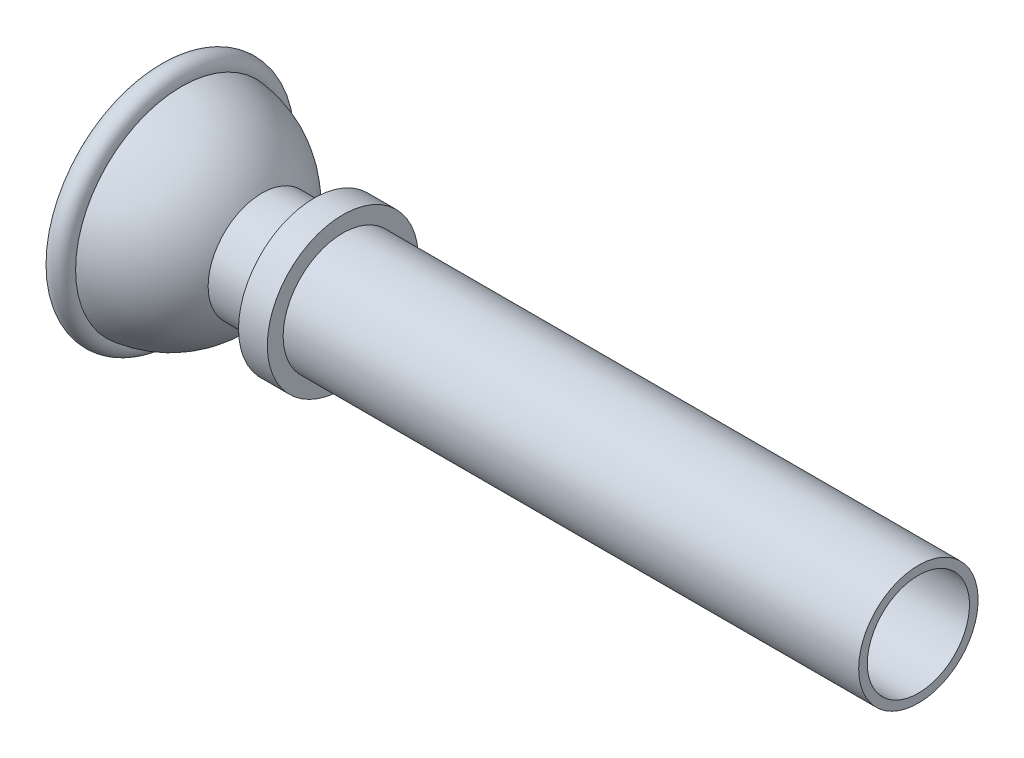
ISO-10303-21;
HEADER;
FILE_DESCRIPTION(('STEP AP214'),'2;1');
FILE_NAME('part.step','',(''),(''),'','','');
FILE_SCHEMA(('AUTOMOTIVE_DESIGN { 1 0 10303 214 1 1 1 1 }'));
ENDSEC;
DATA;
#1=APPLICATION_CONTEXT('core data for automotive mechanical design processes');
#2=APPLICATION_PROTOCOL_DEFINITION('international standard','automotive_design',2000,#1);
#3=PRODUCT_CONTEXT('',#1,'mechanical');
#4=PRODUCT('Part','Part','',(#3));
#5=PRODUCT_RELATED_PRODUCT_CATEGORY('part','',(#4));
#6=PRODUCT_DEFINITION_FORMATION('','',#4);
#7=PRODUCT_DEFINITION_CONTEXT('part definition',#1,'design');
#8=PRODUCT_DEFINITION('design','',#6,#7);
#9=PRODUCT_DEFINITION_SHAPE('','',#8);
#10=(LENGTH_UNIT() NAMED_UNIT(*) SI_UNIT(.MILLI.,.METRE.));
#11=(NAMED_UNIT(*) PLANE_ANGLE_UNIT() SI_UNIT($,.RADIAN.));
#12=(NAMED_UNIT(*) SI_UNIT($,.STERADIAN.) SOLID_ANGLE_UNIT());
#13=UNCERTAINTY_MEASURE_WITH_UNIT(LENGTH_MEASURE(1.E-05),#10,'distance_accuracy_value','');
#14=(GEOMETRIC_REPRESENTATION_CONTEXT(3) GLOBAL_UNCERTAINTY_ASSIGNED_CONTEXT((#13)) GLOBAL_UNIT_ASSIGNED_CONTEXT((#10,
#11,#12)) REPRESENTATION_CONTEXT('',''));
#15=CARTESIAN_POINT('',(0.,0.,0.));
#16=DIRECTION('',(0.,0.,1.));
#17=DIRECTION('',(1.,0.,0.));
#18=AXIS2_PLACEMENT_3D('',#15,#16,#17);
#19=CARTESIAN_POINT('',(117.558988859747,6.49609802983514,0.));
#20=DIRECTION('',(-1.,0.,0.));
#21=DIRECTION('',(0.,0.,1.));
#22=AXIS2_PLACEMENT_3D('',#19,#20,#21);
#23=PLANE('',#22);
#24=CARTESIAN_POINT('',(117.558988859747,-2.52090197016486,0.));
#25=DIRECTION('',(-1.,0.,0.));
#26=DIRECTION('',(0.,0.,1.));
#27=AXIS2_PLACEMENT_3D('',#24,#25,#26);
#28=CIRCLE('',#27,10.541);
#29=CARTESIAN_POINT('',(117.558988859747,-2.52090197016486,10.541));
#30=VERTEX_POINT('',#29);
#31=EDGE_CURVE('E10',#30,#30,#28,.T.);
#32=ORIENTED_EDGE('',*,*,#31,.F.);
#33=EDGE_LOOP('',(#32));
#34=FACE_BOUND('',#33,.T.);
#35=CARTESIAN_POINT('',(117.558988859747,-2.52090197016486,0.));
#36=DIRECTION('',(-1.,0.,0.));
#37=DIRECTION('',(0.,0.,1.));
#38=AXIS2_PLACEMENT_3D('',#35,#36,#37);
#39=CIRCLE('',#38,9.017);
#40=CARTESIAN_POINT('',(117.558988859747,-2.52090197016486,9.017));
#41=VERTEX_POINT('',#40);
#42=EDGE_CURVE('E74',#41,#41,#39,.T.);
#43=ORIENTED_EDGE('',*,*,#42,.T.);
#44=EDGE_LOOP('',(#43));
#45=FACE_BOUND('',#44,.T.);
#46=ADVANCED_FACE('F34',(#34,#45),#23,.F.);
#47=CARTESIAN_POINT('',(-17.599665340704,-2.52090197016486,0.));
#48=DIRECTION('',(-1.,0.,0.));
#49=DIRECTION('',(0.,0.,1.));
#50=AXIS2_PLACEMENT_3D('',#47,#48,#49);
#51=CYLINDRICAL_SURFACE('',#50,10.541);
#52=CARTESIAN_POINT('',(15.9589888597466,-2.52090197016486,0.));
#53=DIRECTION('',(-1.,0.,0.));
#54=DIRECTION('',(0.,0.,1.));
#55=AXIS2_PLACEMENT_3D('',#52,#53,#54);
#56=CIRCLE('',#55,10.541);
#57=CARTESIAN_POINT('',(15.9589888597466,-2.52090197016486,10.541));
#58=VERTEX_POINT('',#57);
#59=EDGE_CURVE('E40',#58,#58,#56,.T.);
#60=ORIENTED_EDGE('',*,*,#59,.F.);
#61=EDGE_LOOP('',(#60));
#62=FACE_BOUND('',#61,.T.);
#63=ORIENTED_EDGE('',*,*,#31,.T.);
#64=EDGE_LOOP('',(#63));
#65=FACE_BOUND('',#64,.T.);
#66=ADVANCED_FACE('F135',(#62,#65),#51,.T.);
#67=CARTESIAN_POINT('',(15.9589888597466,8.02009802983513,0.));
#68=DIRECTION('',(-1.,0.,0.));
#69=DIRECTION('',(0.,0.,1.));
#70=AXIS2_PLACEMENT_3D('',#67,#68,#69);
#71=PLANE('',#70);
#72=CARTESIAN_POINT('',(15.9589888597466,-2.52090197016486,0.));
#73=DIRECTION('',(-1.,0.,0.));
#74=DIRECTION('',(0.,0.,1.));
#75=AXIS2_PLACEMENT_3D('',#72,#73,#74);
#76=CIRCLE('',#75,13.335);
#77=CARTESIAN_POINT('',(15.9589888597466,-2.52090197016486,13.335));
#78=VERTEX_POINT('',#77);
#79=EDGE_CURVE('E44',#78,#78,#76,.T.);
#80=ORIENTED_EDGE('',*,*,#79,.F.);
#81=EDGE_LOOP('',(#80));
#82=FACE_BOUND('',#81,.T.);
#83=ORIENTED_EDGE('',*,*,#59,.T.);
#84=EDGE_LOOP('',(#83));
#85=FACE_BOUND('',#84,.T.);
#86=ADVANCED_FACE('F130',(#82,#85),#71,.F.);
#87=CARTESIAN_POINT('',(-17.599665340704,-2.52090197016486,0.));
#88=DIRECTION('',(-1.,0.,0.));
#89=DIRECTION('',(0.,0.,1.));
#90=AXIS2_PLACEMENT_3D('',#87,#88,#89);
#91=CYLINDRICAL_SURFACE('',#90,13.335);
#92=CARTESIAN_POINT('',(10.8789888597466,-2.52090197016486,0.));
#93=DIRECTION('',(-1.,0.,0.));
#94=DIRECTION('',(0.,0.,1.));
#95=AXIS2_PLACEMENT_3D('',#92,#93,#94);
#96=CIRCLE('',#95,13.335);
#97=CARTESIAN_POINT('',(10.8789888597466,-2.52090197016486,13.335));
#98=VERTEX_POINT('',#97);
#99=EDGE_CURVE('E48',#98,#98,#96,.T.);
#100=ORIENTED_EDGE('',*,*,#99,.F.);
#101=EDGE_LOOP('',(#100));
#102=FACE_BOUND('',#101,.T.);
#103=ORIENTED_EDGE('',*,*,#79,.T.);
#104=EDGE_LOOP('',(#103));
#105=FACE_BOUND('',#104,.T.);
#106=ADVANCED_FACE('F124',(#102,#105),#91,.T.);
#107=CARTESIAN_POINT('',(10.8789888597466,10.8140980298351,0.));
#108=DIRECTION('',(1.,0.,0.));
#109=DIRECTION('',(0.,0.,-1.));
#110=AXIS2_PLACEMENT_3D('',#107,#108,#109);
#111=PLANE('',#110);
#112=CARTESIAN_POINT('',(10.8789888597466,-2.52090197016486,0.));
#113=DIRECTION('',(-1.,0.,0.));
#114=DIRECTION('',(0.,0.,1.));
#115=AXIS2_PLACEMENT_3D('',#112,#113,#114);
#116=CIRCLE('',#115,9.51774831940588);
#117=CARTESIAN_POINT('',(10.8789888597466,-2.52090197016486,9.51774831940588));
#118=VERTEX_POINT('',#117);
#119=EDGE_CURVE('E53',#118,#118,#116,.T.);
#120=ORIENTED_EDGE('',*,*,#119,.F.);
#121=EDGE_LOOP('',(#120));
#122=FACE_BOUND('',#121,.T.);
#123=ORIENTED_EDGE('',*,*,#99,.T.);
#124=EDGE_LOOP('',(#123));
#125=FACE_BOUND('',#124,.T.);
#126=ADVANCED_FACE('F118',(#122,#125),#111,.F.);
#127=CARTESIAN_POINT('',(-17.599665340704,-2.52090197016486,0.));
#128=DIRECTION('',(-1.,0.,0.));
#129=DIRECTION('',(0.,0.,1.));
#130=AXIS2_PLACEMENT_3D('',#127,#128,#129);
#131=CYLINDRICAL_SURFACE('',#130,9.51774831940588);
#132=CARTESIAN_POINT('',(1.6960114580087,-2.52090197016486,0.));
#133=DIRECTION('',(-1.,0.,0.));
#134=DIRECTION('',(0.,0.,1.));
#135=AXIS2_PLACEMENT_3D('',#132,#133,#134);
#136=CIRCLE('',#135,9.51774831940588);
#137=CARTESIAN_POINT('',(1.69601145800871,6.99684634924101,0.));
#138=VERTEX_POINT('',#137);
#139=EDGE_CURVE('E56',#138,#138,#136,.T.);
#140=ORIENTED_EDGE('',*,*,#139,.F.);
#141=EDGE_LOOP('',(#140));
#142=FACE_BOUND('',#141,.T.);
#143=ORIENTED_EDGE('',*,*,#119,.T.);
#144=EDGE_LOOP('',(#143));
#145=FACE_BOUND('',#144,.T.);
#146=ADVANCED_FACE('F112',(#142,#145),#131,.T.);
#147=CARTESIAN_POINT('',(-14.5210111402534,-2.52090197016486,0.));
#148=DIRECTION('',(-1.,0.,0.));
#149=DIRECTION('',(0.,1.,0.));
#150=AXIS2_PLACEMENT_3D('',#147,#148,#149);
#151=SPHERICAL_SURFACE('',#150,18.8037058853859);
#152=CARTESIAN_POINT('',(-12.5199209794463,-2.52090197016486,0.));
#153=DIRECTION('',(-1.,0.,0.));
#154=DIRECTION('',(0.,0.,1.));
#155=AXIS2_PLACEMENT_3D('',#152,#153,#154);
#156=CIRCLE('',#155,18.6969246987952);
#157=CARTESIAN_POINT('',(-12.5199209794463,16.1760227286303,0.));
#158=VERTEX_POINT('',#157);
#159=EDGE_CURVE('E59',#158,#158,#156,.T.);
#160=CARTESIAN_POINT('',(-12.5199209794463,16.1760227286303,0.));
#161=CARTESIAN_POINT('',(-12.3381236598709,16.1565661860425,0.));
#162=CARTESIAN_POINT('',(-12.1566103381494,16.1344565333878,0.));
#163=CARTESIAN_POINT('',(-11.7943056440047,16.0849533652768,0.));
#164=CARTESIAN_POINT('',(-11.6135142715816,16.0575598498204,0.));
#165=CARTESIAN_POINT('',(-11.2528074296246,15.997511313438,0.));
#166=CARTESIAN_POINT('',(-11.0728919600907,15.9648562925119,0.));
#167=CARTESIAN_POINT('',(-10.7140899676627,15.8943127838189,0.));
#168=CARTESIAN_POINT('',(-10.5352034447687,15.8564242960519,0.));
#169=CARTESIAN_POINT('',(-10.1786115580082,15.77544602235,0.));
#170=CARTESIAN_POINT('',(-10.0009061941418,15.7323562364153,0.));
#171=CARTESIAN_POINT('',(-9.646827821035,15.6410120469899,0.));
#172=CARTESIAN_POINT('',(-9.47045481179461,15.5927576434993,0.));
#173=CARTESIAN_POINT('',(-9.11919121308942,15.4911252706417,0.));
#174=CARTESIAN_POINT('',(-8.94430062362463,15.4377473012748,0.));
#175=CARTESIAN_POINT('',(-8.59615066747593,15.325913213867,0.));
#176=CARTESIAN_POINT('',(-8.42289130079203,15.2674570958263,0.));
#177=CARTESIAN_POINT('',(-8.07815120553487,15.1455164472806,0.));
#178=CARTESIAN_POINT('',(-7.90667047696163,15.0820319167756,0.));
#179=CARTESIAN_POINT('',(-7.56563355986559,14.9500884583108,0.));
#180=CARTESIAN_POINT('',(-7.39607737134279,14.8816295303508,0.));
#181=CARTESIAN_POINT('',(-7.05903379883606,14.7397955242613,0.));
#182=CARTESIAN_POINT('',(-6.89154641485214,14.6664204461318,0.));
#183=CARTESIAN_POINT('',(-6.55878295569412,14.5148165698573,0.));
#184=CARTESIAN_POINT('',(-6.39350688052003,14.4365877717124,0.));
#185=CARTESIAN_POINT('',(-6.065306661793,14.2753430152719,0.));
#186=CARTESIAN_POINT('',(-5.90238251824006,14.1923270569763,0.));
#187=CARTESIAN_POINT('',(-5.57902478445857,14.021578613189,0.));
#188=CARTESIAN_POINT('',(-5.41859119423002,13.9338461276972,0.));
#189=CARTESIAN_POINT('',(-5.10035106974857,13.7537392754619,0.));
#190=CARTESIAN_POINT('',(-4.94254453549567,13.6613649087184,0.));
#191=CARTESIAN_POINT('',(-4.62969279042332,13.472052889403,0.));
#192=CARTESIAN_POINT('',(-4.47464757960387,13.3751152368312,0.));
#193=CARTESIAN_POINT('',(-4.16745039942326,13.1767591238899,0.));
#194=CARTESIAN_POINT('',(-4.01529843006209,13.0753406635205,0.));
#195=CARTESIAN_POINT('',(-3.71401718914928,12.8681092254467,0.));
#196=CARTESIAN_POINT('',(-3.56488791759763,12.7622962477424,0.));
#197=CARTESIAN_POINT('',(-3.26977895683546,12.5463658044743,0.));
#198=CARTESIAN_POINT('',(-3.12379926762494,12.4362483389106,0.));
#199=CARTESIAN_POINT('',(-2.83511367629886,12.211802611812,0.));
#200=CARTESIAN_POINT('',(-2.69240777418332,12.0974743502772,0.));
#201=CARTESIAN_POINT('',(-2.41039117634616,11.8647043058204,0.));
#202=CARTESIAN_POINT('',(-2.27108048062454,11.7462625228986,0.));
#203=CARTESIAN_POINT('',(-1.99597282610887,11.5053662101847,0.));
#204=CARTESIAN_POINT('',(-1.86017586731481,11.3829116803927,0.));
#205=CARTESIAN_POINT('',(-1.59221122758186,11.1340940626397,0.));
#206=CARTESIAN_POINT('',(-1.46004354664296,11.0077309746787,0.));
#207=CARTESIAN_POINT('',(-1.19944991560083,10.7512037548475,0.));
#208=CARTESIAN_POINT('',(-1.07102396549759,10.6210396229773,0.));
#209=CARTESIAN_POINT('',(-0.818023065610653,10.3570210635879,0.));
#210=CARTESIAN_POINT('',(-0.693448115826956,10.2231666360687,0.));
#211=CARTESIAN_POINT('',(-0.448255209112579,9.95188137371628,0.));
#212=CARTESIAN_POINT('',(-0.327637252181899,9.81445053888308,0.));
#213=CARTESIAN_POINT('',(-0.0904609583785018,9.53612939228143,0.));
#214=CARTESIAN_POINT('',(0.0260973784942146,9.39523908051298,0.));
#215=CARTESIAN_POINT('',(0.255055264357322,9.11011885719512,0.));
#216=CARTESIAN_POINT('',(0.367454813347712,8.96588894564571,0.));
#217=CARTESIAN_POINT('',(0.587999474249429,8.67421222894919,0.));
#218=CARTESIAN_POINT('',(0.696144586160756,8.52676542380208,0.));
#219=CARTESIAN_POINT('',(0.908088417497862,8.22878040950243,0.));
#220=CARTESIAN_POINT('',(1.01188713692364,8.07824220034988,0.));
#221=CARTESIAN_POINT('',(1.21504964991743,7.77420232488891,0.));
#222=CARTESIAN_POINT('',(1.31441344348544,7.62070065858048,0.));
#223=CARTESIAN_POINT('',(1.50862237495204,7.3108649827927,0.));
#224=CARTESIAN_POINT('',(1.60346751285064,7.15453097331334,0.));
#225=CARTESIAN_POINT('',(1.69601145800871,6.99684634924101,0.));
#226=B_SPLINE_CURVE_WITH_KNOTS('',3,(#160,#161,#162,#163,#164,#165,#166,#167,#168,#169,#170,
#171,#172,#173,#174,#175,#176,#177,#178,#179,#180,#181,#182,#183,#184,#185,#186,#187,#188,#189,
#190,#191,#192,#193,#194,#195,#196,#197,#198,#199,#200,#201,#202,#203,#204,#205,#206,#207,#208,
#209,#210,#211,#212,#213,#214,#215,#216,#217,#218,#219,#220,#221,#222,#223,#224,#225),
.UNSPECIFIED.,.F.,.F.,(4,2,2,2,2,2,2,2,2,2,2,2,2,2,2,2,2,2,2,2,2,2,2,2,2,2,2,2,2,2,2,2,4),(0.,
0.548487003998216,1.09697400799643,1.64546101199464,2.19394801599286,2.74243501999107,
3.29092202398929,3.8394090279875,4.38789603198572,4.93638303598393,5.48487003998215,
6.03335704398036,6.58184404797858,7.13033105197679,7.67881805597501,8.22730505997322,
8.77579206397144,9.32427906796965,9.87276607196786,10.4212530759661,10.9697400799643,
11.5182270839625,12.0667140879607,12.6152010919589,13.1636880959572,13.7121750999554,
14.2606621039536,14.8091491079518,15.35763611195,15.9061231159482,16.4546101199464,
17.0030971239447,17.5515841279429),.UNSPECIFIED.);
#227=EDGE_CURVE('BSEAM106',#158,#138,#226,.T.);
#228=ORIENTED_EDGE('',*,*,#159,.F.);
#229=ORIENTED_EDGE('',*,*,#139,.T.);
#230=ORIENTED_EDGE('',*,*,#227,.T.);
#231=ORIENTED_EDGE('',*,*,#227,.F.);
#232=EDGE_LOOP('',(#228,#230,#229,#231));
#233=FACE_BOUND('',#232,.T.);
#234=ADVANCED_FACE('F106',(#233),#151,.T.);
#235=CARTESIAN_POINT('',(-14.5210111402534,-2.52090197016486,0.));
#236=DIRECTION('',(-1.,0.,0.));
#237=DIRECTION('',(0.,0.,1.));
#238=AXIS2_PLACEMENT_3D('',#235,#236,#237);
#239=TOROIDAL_SURFACE('',#238,19.05,2.032);
#240=CARTESIAN_POINT('',(-14.5210111402534,-2.52090197016486,0.));
#241=DIRECTION('',(-1.,0.,0.));
#242=DIRECTION('',(0.,0.,1.));
#243=AXIS2_PLACEMENT_3D('',#240,#241,#242);
#244=CIRCLE('',#243,17.018);
#245=CARTESIAN_POINT('',(-14.5210111402534,-2.52090197016486,17.018));
#246=VERTEX_POINT('',#245);
#247=EDGE_CURVE('E62',#246,#246,#244,.T.);
#248=ORIENTED_EDGE('',*,*,#247,.F.);
#249=EDGE_LOOP('',(#248));
#250=FACE_BOUND('',#249,.T.);
#251=ORIENTED_EDGE('',*,*,#159,.T.);
#252=EDGE_LOOP('',(#251));
#253=FACE_BOUND('',#252,.T.);
#254=ADVANCED_FACE('F100',(#250,#253),#239,.T.);
#255=CARTESIAN_POINT('',(-14.5210111402534,-2.52090197016486,0.));
#256=DIRECTION('',(-1.,0.,0.));
#257=DIRECTION('',(0.,1.,0.));
#258=AXIS2_PLACEMENT_3D('',#255,#256,#257);
#259=SPHERICAL_SURFACE('',#258,17.018);
#260=CARTESIAN_POINT('',(1.26790345195339,-2.52090197016486,0.));
#261=DIRECTION('',(-1.,0.,0.));
#262=DIRECTION('',(0.,0.,1.));
#263=AXIS2_PLACEMENT_3D('',#260,#261,#262);
#264=CIRCLE('',#263,6.35);
#265=CARTESIAN_POINT('',(1.26790345195339,-2.52090197016486,6.35));
#266=VERTEX_POINT('',#265);
#267=EDGE_CURVE('E65',#266,#266,#264,.T.);
#268=ORIENTED_EDGE('',*,*,#267,.F.);
#269=EDGE_LOOP('',(#268));
#270=FACE_BOUND('',#269,.T.);
#271=ORIENTED_EDGE('',*,*,#247,.T.);
#272=EDGE_LOOP('',(#271));
#273=FACE_BOUND('',#272,.T.);
#274=ADVANCED_FACE('F94',(#270,#273),#259,.F.);
#275=CARTESIAN_POINT('',(-17.599665340704,-2.52090197016486,0.));
#276=DIRECTION('',(-1.,0.,0.));
#277=DIRECTION('',(0.,0.,1.));
#278=AXIS2_PLACEMENT_3D('',#275,#276,#277);
#279=CYLINDRICAL_SURFACE('',#278,6.35);
#280=CARTESIAN_POINT('',(15.9589888597466,-2.52090197016486,0.));
#281=DIRECTION('',(-1.,0.,0.));
#282=DIRECTION('',(0.,0.,1.));
#283=AXIS2_PLACEMENT_3D('',#280,#281,#282);
#284=CIRCLE('',#283,6.35);
#285=CARTESIAN_POINT('',(15.9589888597466,-2.52090197016486,6.35));
#286=VERTEX_POINT('',#285);
#287=EDGE_CURVE('E68',#286,#286,#284,.T.);
#288=ORIENTED_EDGE('',*,*,#287,.F.);
#289=EDGE_LOOP('',(#288));
#290=FACE_BOUND('',#289,.T.);
#291=ORIENTED_EDGE('',*,*,#267,.T.);
#292=EDGE_LOOP('',(#291));
#293=FACE_BOUND('',#292,.T.);
#294=ADVANCED_FACE('F88',(#290,#293),#279,.F.);
#295=CARTESIAN_POINT('',(15.9589888597466,6.49609802983513,0.));
#296=DIRECTION('',(-1.,0.,0.));
#297=DIRECTION('',(0.,0.,1.));
#298=AXIS2_PLACEMENT_3D('',#295,#296,#297);
#299=PLANE('',#298);
#300=CARTESIAN_POINT('',(15.9589888597466,-2.52090197016486,0.));
#301=DIRECTION('',(-1.,0.,0.));
#302=DIRECTION('',(0.,0.,1.));
#303=AXIS2_PLACEMENT_3D('',#300,#301,#302);
#304=CIRCLE('',#303,9.01699999999999);
#305=CARTESIAN_POINT('',(15.9589888597466,-2.52090197016486,9.01699999999999));
#306=VERTEX_POINT('',#305);
#307=EDGE_CURVE('E71',#306,#306,#304,.T.);
#308=ORIENTED_EDGE('',*,*,#307,.F.);
#309=EDGE_LOOP('',(#308));
#310=FACE_BOUND('',#309,.T.);
#311=ORIENTED_EDGE('',*,*,#287,.T.);
#312=EDGE_LOOP('',(#311));
#313=FACE_BOUND('',#312,.T.);
#314=ADVANCED_FACE('F82',(#310,#313),#299,.F.);
#315=CARTESIAN_POINT('',(-17.599665340704,-2.52090197016486,0.));
#316=DIRECTION('',(-1.,0.,0.));
#317=DIRECTION('',(0.,0.,1.));
#318=AXIS2_PLACEMENT_3D('',#315,#316,#317);
#319=CYLINDRICAL_SURFACE('',#318,9.01699999999999);
#320=ORIENTED_EDGE('',*,*,#42,.F.);
#321=EDGE_LOOP('',(#320));
#322=FACE_BOUND('',#321,.T.);
#323=ORIENTED_EDGE('',*,*,#307,.T.);
#324=EDGE_LOOP('',(#323));
#325=FACE_BOUND('',#324,.T.);
#326=ADVANCED_FACE('F79',(#322,#325),#319,.F.);
#327=CLOSED_SHELL('',(#46,#66,#86,#106,#126,#146,#234,#254,#274,#294,#314,#326));
#328=MANIFOLD_SOLID_BREP('B2',#327);
#329=ADVANCED_BREP_SHAPE_REPRESENTATION('',(#18,#328),#14);
#330=SHAPE_DEFINITION_REPRESENTATION(#9,#329);
ENDSEC;
END-ISO-10303-21;
